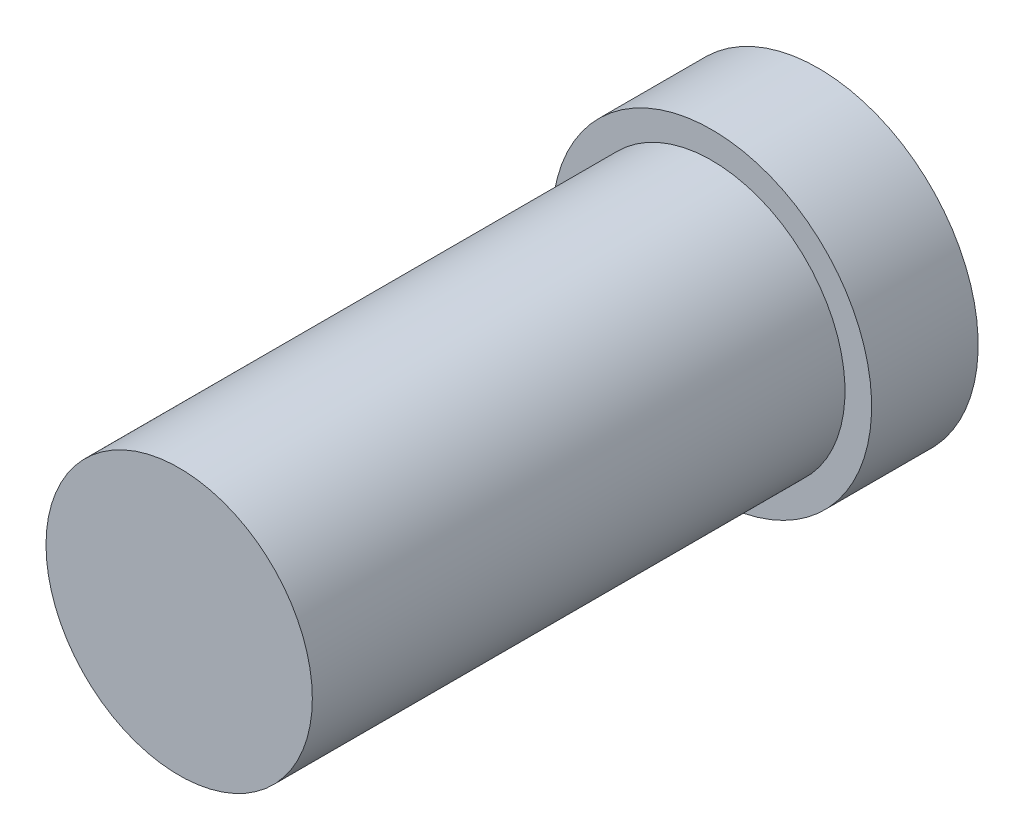
ISO-10303-21;
HEADER;
FILE_DESCRIPTION(('STEP AP214'),'2;1');
FILE_NAME('part.step','',(''),(''),'','','');
FILE_SCHEMA(('AUTOMOTIVE_DESIGN { 1 0 10303 214 1 1 1 1 }'));
ENDSEC;
DATA;
#1=APPLICATION_CONTEXT('core data for automotive mechanical design processes');
#2=APPLICATION_PROTOCOL_DEFINITION('international standard','automotive_design',2000,#1);
#3=PRODUCT_CONTEXT('',#1,'mechanical');
#4=PRODUCT('Part','Part','',(#3));
#5=PRODUCT_RELATED_PRODUCT_CATEGORY('part','',(#4));
#6=PRODUCT_DEFINITION_FORMATION('','',#4);
#7=PRODUCT_DEFINITION_CONTEXT('part definition',#1,'design');
#8=PRODUCT_DEFINITION('design','',#6,#7);
#9=PRODUCT_DEFINITION_SHAPE('','',#8);
#10=(LENGTH_UNIT() NAMED_UNIT(*) SI_UNIT(.MILLI.,.METRE.));
#11=(NAMED_UNIT(*) PLANE_ANGLE_UNIT() SI_UNIT($,.RADIAN.));
#12=(NAMED_UNIT(*) SI_UNIT($,.STERADIAN.) SOLID_ANGLE_UNIT());
#13=UNCERTAINTY_MEASURE_WITH_UNIT(LENGTH_MEASURE(1.E-05),#10,'distance_accuracy_value','');
#14=(GEOMETRIC_REPRESENTATION_CONTEXT(3) GLOBAL_UNCERTAINTY_ASSIGNED_CONTEXT((#13)) GLOBAL_UNIT_ASSIGNED_CONTEXT((#10,
#11,#12)) REPRESENTATION_CONTEXT('',''));
#15=CARTESIAN_POINT('',(0.,0.,0.));
#16=DIRECTION('',(0.,0.,1.));
#17=DIRECTION('',(1.,0.,0.));
#18=AXIS2_PLACEMENT_3D('',#15,#16,#17);
#19=CARTESIAN_POINT('',(0.,0.,10.));
#20=DIRECTION('',(0.,0.,-1.));
#21=DIRECTION('',(-1.,0.,0.));
#22=AXIS2_PLACEMENT_3D('',#19,#20,#21);
#23=CYLINDRICAL_SURFACE('',#22,2.5);
#24=CARTESIAN_POINT('',(0.,0.,10.));
#25=DIRECTION('',(0.,0.,1.));
#26=DIRECTION('',(1.,0.,0.));
#27=AXIS2_PLACEMENT_3D('',#24,#25,#26);
#28=CIRCLE('',#27,2.5);
#29=CARTESIAN_POINT('',(2.5,0.,10.));
#30=VERTEX_POINT('',#29);
#31=EDGE_CURVE('E10',#30,#30,#28,.T.);
#32=ORIENTED_EDGE('',*,*,#31,.F.);
#33=EDGE_LOOP('',(#32));
#34=FACE_BOUND('',#33,.T.);
#35=CARTESIAN_POINT('',(0.,0.,0.));
#36=DIRECTION('',(0.,0.,-1.));
#37=DIRECTION('',(-1.,0.,0.));
#38=AXIS2_PLACEMENT_3D('',#35,#36,#37);
#39=CIRCLE('',#38,2.5);
#40=CARTESIAN_POINT('',(-2.5,0.,0.));
#41=VERTEX_POINT('',#40);
#42=EDGE_CURVE('E36',#41,#41,#39,.T.);
#43=ORIENTED_EDGE('',*,*,#42,.F.);
#44=EDGE_LOOP('',(#43));
#45=FACE_BOUND('',#44,.T.);
#46=ADVANCED_FACE('F30',(#34,#45),#23,.T.);
#47=CARTESIAN_POINT('',(0.,0.,10.));
#48=DIRECTION('',(0.,0.,1.));
#49=DIRECTION('',(1.,0.,0.));
#50=AXIS2_PLACEMENT_3D('',#47,#48,#49);
#51=PLANE('',#50);
#52=ORIENTED_EDGE('',*,*,#31,.T.);
#53=EDGE_LOOP('',(#52));
#54=FACE_BOUND('',#53,.T.);
#55=ADVANCED_FACE('F63',(#54),#51,.T.);
#56=CARTESIAN_POINT('',(0.,0.,-2.));
#57=DIRECTION('',(0.,0.,1.));
#58=DIRECTION('',(1.,0.,0.));
#59=AXIS2_PLACEMENT_3D('',#56,#57,#58);
#60=CYLINDRICAL_SURFACE('',#59,3.);
#61=CARTESIAN_POINT('',(0.,0.,-2.));
#62=DIRECTION('',(0.,0.,-1.));
#63=DIRECTION('',(-1.,0.,0.));
#64=AXIS2_PLACEMENT_3D('',#61,#62,#63);
#65=CIRCLE('',#64,3.);
#66=CARTESIAN_POINT('',(-3.,0.,-2.));
#67=VERTEX_POINT('',#66);
#68=EDGE_CURVE('E40',#67,#67,#65,.T.);
#69=ORIENTED_EDGE('',*,*,#68,.F.);
#70=EDGE_LOOP('',(#69));
#71=FACE_BOUND('',#70,.T.);
#72=CARTESIAN_POINT('',(0.,0.,0.));
#73=DIRECTION('',(0.,0.,-1.));
#74=DIRECTION('',(-1.,0.,0.));
#75=AXIS2_PLACEMENT_3D('',#72,#73,#74);
#76=CIRCLE('',#75,3.);
#77=CARTESIAN_POINT('',(-3.,0.,0.));
#78=VERTEX_POINT('',#77);
#79=EDGE_CURVE('E44',#78,#78,#76,.T.);
#80=ORIENTED_EDGE('',*,*,#79,.T.);
#81=EDGE_LOOP('',(#80));
#82=FACE_BOUND('',#81,.T.);
#83=ADVANCED_FACE('F50',(#71,#82),#60,.T.);
#84=CARTESIAN_POINT('',(0.,0.,-2.));
#85=DIRECTION('',(0.,0.,-1.));
#86=DIRECTION('',(-1.,0.,0.));
#87=AXIS2_PLACEMENT_3D('',#84,#85,#86);
#88=PLANE('',#87);
#89=ORIENTED_EDGE('',*,*,#68,.T.);
#90=EDGE_LOOP('',(#89));
#91=FACE_BOUND('',#90,.T.);
#92=ADVANCED_FACE('F54',(#91),#88,.T.);
#93=CARTESIAN_POINT('',(0.,0.,0.));
#94=DIRECTION('',(0.,0.,-1.));
#95=DIRECTION('',(-1.,0.,0.));
#96=AXIS2_PLACEMENT_3D('',#93,#94,#95);
#97=PLANE('',#96);
#98=ORIENTED_EDGE('',*,*,#42,.T.);
#99=EDGE_LOOP('',(#98));
#100=FACE_BOUND('',#99,.T.);
#101=ORIENTED_EDGE('',*,*,#79,.F.);
#102=EDGE_LOOP('',(#101));
#103=FACE_BOUND('',#102,.T.);
#104=ADVANCED_FACE('F52',(#100,#103),#97,.F.);
#105=CLOSED_SHELL('',(#46,#55,#83,#92,#104));
#106=MANIFOLD_SOLID_BREP('B2',#105);
#107=ADVANCED_BREP_SHAPE_REPRESENTATION('',(#18,#106),#14);
#108=SHAPE_DEFINITION_REPRESENTATION(#9,#107);
ENDSEC;
END-ISO-10303-21;
